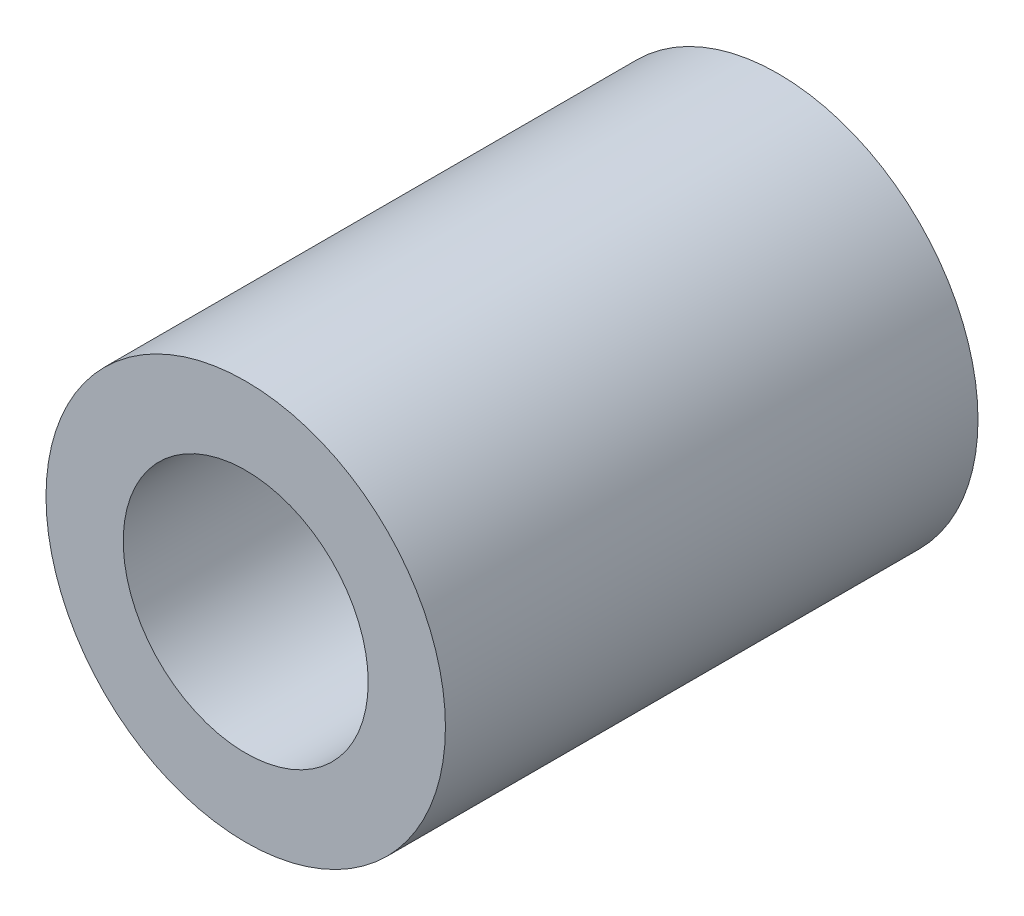
ISO-10303-21;
HEADER;
FILE_DESCRIPTION(('STEP AP214'),'2;1');
FILE_NAME('part.step','',(''),(''),'','','');
FILE_SCHEMA(('AUTOMOTIVE_DESIGN { 1 0 10303 214 1 1 1 1 }'));
ENDSEC;
DATA;
#1=APPLICATION_CONTEXT('core data for automotive mechanical design processes');
#2=APPLICATION_PROTOCOL_DEFINITION('international standard','automotive_design',2000,#1);
#3=PRODUCT_CONTEXT('',#1,'mechanical');
#4=PRODUCT('Part','Part','',(#3));
#5=PRODUCT_RELATED_PRODUCT_CATEGORY('part','',(#4));
#6=PRODUCT_DEFINITION_FORMATION('','',#4);
#7=PRODUCT_DEFINITION_CONTEXT('part definition',#1,'design');
#8=PRODUCT_DEFINITION('design','',#6,#7);
#9=PRODUCT_DEFINITION_SHAPE('','',#8);
#10=(LENGTH_UNIT() NAMED_UNIT(*) SI_UNIT(.MILLI.,.METRE.));
#11=(NAMED_UNIT(*) PLANE_ANGLE_UNIT() SI_UNIT($,.RADIAN.));
#12=(NAMED_UNIT(*) SI_UNIT($,.STERADIAN.) SOLID_ANGLE_UNIT());
#13=UNCERTAINTY_MEASURE_WITH_UNIT(LENGTH_MEASURE(1.E-05),#10,'distance_accuracy_value','');
#14=(GEOMETRIC_REPRESENTATION_CONTEXT(3) GLOBAL_UNCERTAINTY_ASSIGNED_CONTEXT((#13)) GLOBAL_UNIT_ASSIGNED_CONTEXT((#10,
#11,#12)) REPRESENTATION_CONTEXT('',''));
#15=CARTESIAN_POINT('',(0.,0.,0.));
#16=DIRECTION('',(0.,0.,1.));
#17=DIRECTION('',(1.,0.,0.));
#18=AXIS2_PLACEMENT_3D('',#15,#16,#17);
#19=CARTESIAN_POINT('',(0.,0.,3.175));
#20=DIRECTION('',(0.,0.,1.));
#21=DIRECTION('',(1.,0.,0.));
#22=AXIS2_PLACEMENT_3D('',#19,#20,#21);
#23=PLANE('',#22);
#24=CARTESIAN_POINT('',(0.,0.,3.175));
#25=DIRECTION('',(0.,0.,1.));
#26=DIRECTION('',(1.,0.,0.));
#27=AXIS2_PLACEMENT_3D('',#24,#25,#26);
#28=CIRCLE('',#27,2.38125);
#29=CARTESIAN_POINT('',(2.38125,0.,3.175));
#30=VERTEX_POINT('',#29);
#31=EDGE_CURVE('E10',#30,#30,#28,.T.);
#32=ORIENTED_EDGE('',*,*,#31,.T.);
#33=EDGE_LOOP('',(#32));
#34=FACE_BOUND('',#33,.T.);
#35=CARTESIAN_POINT('',(0.,0.,3.175));
#36=DIRECTION('',(0.,0.,1.));
#37=DIRECTION('',(1.,0.,0.));
#38=AXIS2_PLACEMENT_3D('',#35,#36,#37);
#39=CIRCLE('',#38,1.4605);
#40=CARTESIAN_POINT('',(1.4605,0.,3.175));
#41=VERTEX_POINT('',#40);
#42=EDGE_CURVE('E41',#41,#41,#39,.T.);
#43=ORIENTED_EDGE('',*,*,#42,.F.);
#44=EDGE_LOOP('',(#43));
#45=FACE_BOUND('',#44,.T.);
#46=ADVANCED_FACE('F30',(#34,#45),#23,.T.);
#47=CARTESIAN_POINT('',(0.,0.,-3.175));
#48=DIRECTION('',(0.,0.,1.));
#49=DIRECTION('',(1.,0.,0.));
#50=AXIS2_PLACEMENT_3D('',#47,#48,#49);
#51=PLANE('',#50);
#52=CARTESIAN_POINT('',(0.,0.,-3.175));
#53=DIRECTION('',(0.,0.,1.));
#54=DIRECTION('',(1.,0.,0.));
#55=AXIS2_PLACEMENT_3D('',#52,#53,#54);
#56=CIRCLE('',#55,2.38125);
#57=CARTESIAN_POINT('',(2.38125,0.,-3.175));
#58=VERTEX_POINT('',#57);
#59=EDGE_CURVE('E34',#58,#58,#56,.T.);
#60=ORIENTED_EDGE('',*,*,#59,.F.);
#61=EDGE_LOOP('',(#60));
#62=FACE_BOUND('',#61,.T.);
#63=CARTESIAN_POINT('',(0.,0.,-3.175));
#64=DIRECTION('',(0.,0.,1.));
#65=DIRECTION('',(1.,0.,0.));
#66=AXIS2_PLACEMENT_3D('',#63,#64,#65);
#67=CIRCLE('',#66,1.4605);
#68=CARTESIAN_POINT('',(1.4605,0.,-3.175));
#69=VERTEX_POINT('',#68);
#70=EDGE_CURVE('E43',#69,#69,#67,.T.);
#71=ORIENTED_EDGE('',*,*,#70,.T.);
#72=EDGE_LOOP('',(#71));
#73=FACE_BOUND('',#72,.T.);
#74=ADVANCED_FACE('F53',(#62,#73),#51,.F.);
#75=CARTESIAN_POINT('',(0.,0.,3.175));
#76=DIRECTION('',(0.,0.,-1.));
#77=DIRECTION('',(-1.,0.,0.));
#78=AXIS2_PLACEMENT_3D('',#75,#76,#77);
#79=CYLINDRICAL_SURFACE('',#78,2.38125);
#80=ORIENTED_EDGE('',*,*,#31,.F.);
#81=EDGE_LOOP('',(#80));
#82=FACE_BOUND('',#81,.T.);
#83=ORIENTED_EDGE('',*,*,#59,.T.);
#84=EDGE_LOOP('',(#83));
#85=FACE_BOUND('',#84,.T.);
#86=ADVANCED_FACE('F32',(#82,#85),#79,.T.);
#87=CARTESIAN_POINT('',(0.,0.,3.175));
#88=DIRECTION('',(0.,0.,-1.));
#89=DIRECTION('',(-1.,0.,0.));
#90=AXIS2_PLACEMENT_3D('',#87,#88,#89);
#91=CYLINDRICAL_SURFACE('',#90,1.4605);
#92=ORIENTED_EDGE('',*,*,#42,.T.);
#93=EDGE_LOOP('',(#92));
#94=FACE_BOUND('',#93,.T.);
#95=ORIENTED_EDGE('',*,*,#70,.F.);
#96=EDGE_LOOP('',(#95));
#97=FACE_BOUND('',#96,.T.);
#98=ADVANCED_FACE('F49',(#94,#97),#91,.F.);
#99=CLOSED_SHELL('',(#46,#74,#86,#98));
#100=MANIFOLD_SOLID_BREP('B2',#99);
#101=ADVANCED_BREP_SHAPE_REPRESENTATION('',(#18,#100),#14);
#102=SHAPE_DEFINITION_REPRESENTATION(#9,#101);
ENDSEC;
END-ISO-10303-21;
